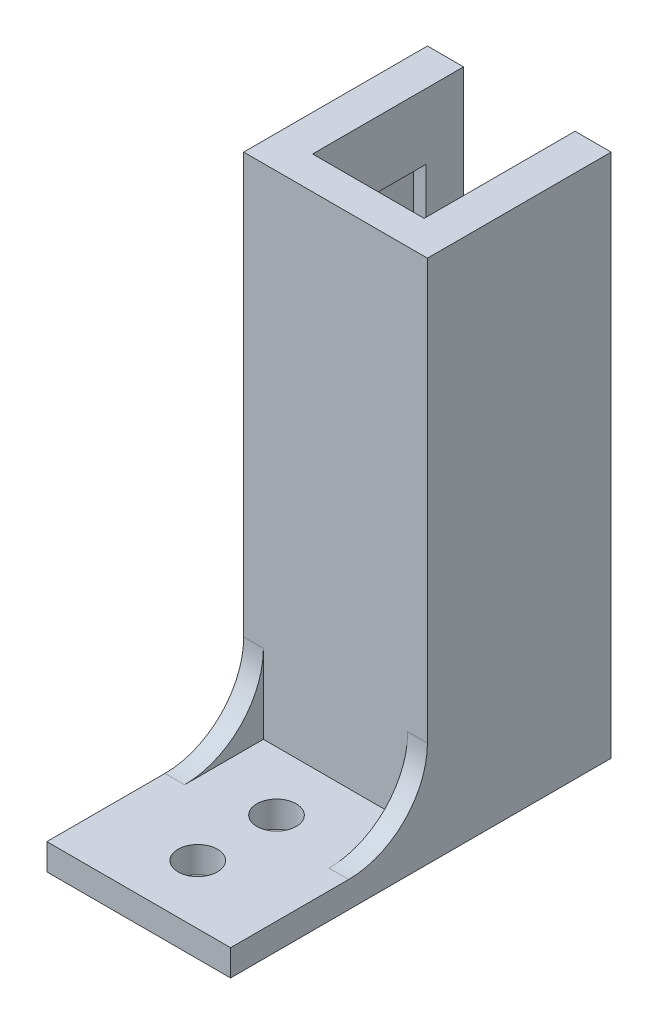
ISO-10303-21;
HEADER;
FILE_DESCRIPTION(('STEP AP214'),'2;1');
FILE_NAME('part.step','',(''),(''),'','','');
FILE_SCHEMA(('AUTOMOTIVE_DESIGN { 1 0 10303 214 1 1 1 1 }'));
ENDSEC;
DATA;
#1=APPLICATION_CONTEXT('core data for automotive mechanical design processes');
#2=APPLICATION_PROTOCOL_DEFINITION('international standard','automotive_design',2000,#1);
#3=PRODUCT_CONTEXT('',#1,'mechanical');
#4=PRODUCT('Part','Part','',(#3));
#5=PRODUCT_RELATED_PRODUCT_CATEGORY('part','',(#4));
#6=PRODUCT_DEFINITION_FORMATION('','',#4);
#7=PRODUCT_DEFINITION_CONTEXT('part definition',#1,'design');
#8=PRODUCT_DEFINITION('design','',#6,#7);
#9=PRODUCT_DEFINITION_SHAPE('','',#8);
#10=(LENGTH_UNIT() NAMED_UNIT(*) SI_UNIT(.MILLI.,.METRE.));
#11=(NAMED_UNIT(*) PLANE_ANGLE_UNIT() SI_UNIT($,.RADIAN.));
#12=(NAMED_UNIT(*) SI_UNIT($,.STERADIAN.) SOLID_ANGLE_UNIT());
#13=UNCERTAINTY_MEASURE_WITH_UNIT(LENGTH_MEASURE(1.E-05),#10,'distance_accuracy_value','');
#14=(GEOMETRIC_REPRESENTATION_CONTEXT(3) GLOBAL_UNCERTAINTY_ASSIGNED_CONTEXT((#13)) GLOBAL_UNIT_ASSIGNED_CONTEXT((#10,
#11,#12)) REPRESENTATION_CONTEXT('',''));
#15=CARTESIAN_POINT('',(0.,0.,0.));
#16=DIRECTION('',(0.,0.,1.));
#17=DIRECTION('',(1.,0.,0.));
#18=AXIS2_PLACEMENT_3D('',#15,#16,#17);
#19=CARTESIAN_POINT('',(-5.20000000000001,15.,0.));
#20=DIRECTION('',(1.,0.,0.));
#21=DIRECTION('',(0.,1.,0.));
#22=AXIS2_PLACEMENT_3D('',#19,#20,#21);
#23=PLANE('',#22);
#24=DIRECTION('',(0.,-1.,0.));
#25=VECTOR('',#24,1.);
#26=CARTESIAN_POINT('',(-5.20000000000001,15.,11.5));
#27=LINE('',#26,#25);
#28=CARTESIAN_POINT('',(-5.20000000000001,15.,11.5));
#29=VERTEX_POINT('',#28);
#30=CARTESIAN_POINT('',(-5.2,0.,11.5));
#31=VERTEX_POINT('',#30);
#32=EDGE_CURVE('E232',#29,#31,#27,.T.);
#33=ORIENTED_EDGE('',*,*,#32,.T.);
#34=DIRECTION('',(0.,0.,1.));
#35=VECTOR('',#34,1.);
#36=CARTESIAN_POINT('',(-5.2,0.,11.5));
#37=LINE('',#36,#35);
#38=CARTESIAN_POINT('',(-5.2,0.,2.85));
#39=VERTEX_POINT('',#38);
#40=EDGE_CURVE('E217',#39,#31,#37,.T.);
#41=ORIENTED_EDGE('',*,*,#40,.F.);
#42=DIRECTION('',(0.,-1.,0.));
#43=VECTOR('',#42,1.);
#44=CARTESIAN_POINT('',(-5.20000000000001,15.,2.85));
#45=LINE('',#44,#43);
#46=CARTESIAN_POINT('',(-5.20000000000001,15.,2.85));
#47=VERTEX_POINT('',#46);
#48=EDGE_CURVE('E256',#47,#39,#45,.T.);
#49=ORIENTED_EDGE('',*,*,#48,.F.);
#50=DIRECTION('',(0.,0.,1.));
#51=VECTOR('',#50,1.);
#52=CARTESIAN_POINT('',(-5.20000000000001,15.,0.));
#53=LINE('',#52,#51);
#54=EDGE_CURVE('E223',#47,#29,#53,.T.);
#55=ORIENTED_EDGE('',*,*,#54,.T.);
#56=EDGE_LOOP('',(#33,#41,#49,#55));
#57=FACE_BOUND('',#56,.T.);
#58=ADVANCED_FACE('F44',(#57),#23,.T.);
#59=CARTESIAN_POINT('',(0.,15.,2.85));
#60=DIRECTION('',(0.,0.,1.));
#61=DIRECTION('',(1.,0.,0.));
#62=AXIS2_PLACEMENT_3D('',#59,#60,#61);
#63=PLANE('',#62);
#64=ORIENTED_EDGE('',*,*,#48,.T.);
#65=DIRECTION('',(-1.,0.,0.));
#66=VECTOR('',#65,1.);
#67=CARTESIAN_POINT('',(-5.19999999999999,0.,2.85));
#68=LINE('',#67,#66);
#69=CARTESIAN_POINT('',(-4.25,0.,2.85));
#70=VERTEX_POINT('',#69);
#71=EDGE_CURVE('E369',#70,#39,#68,.T.);
#72=ORIENTED_EDGE('',*,*,#71,.F.);
#73=DIRECTION('',(0.,-1.,0.));
#74=VECTOR('',#73,1.);
#75=CARTESIAN_POINT('',(-4.25000000000001,15.,2.85));
#76=LINE('',#75,#74);
#77=CARTESIAN_POINT('',(-4.25,15.,2.85));
#78=VERTEX_POINT('',#77);
#79=EDGE_CURVE('E253',#78,#70,#76,.T.);
#80=ORIENTED_EDGE('',*,*,#79,.F.);
#81=DIRECTION('',(-1.,0.,0.));
#82=VECTOR('',#81,1.);
#83=CARTESIAN_POINT('',(0.,15.,2.85));
#84=LINE('',#83,#82);
#85=EDGE_CURVE('E228',#78,#47,#84,.T.);
#86=ORIENTED_EDGE('',*,*,#85,.T.);
#87=EDGE_LOOP('',(#64,#72,#80,#86));
#88=FACE_BOUND('',#87,.T.);
#89=ADVANCED_FACE('F497',(#88),#63,.T.);
#90=CARTESIAN_POINT('',(5.19999999999999,15.,0.));
#91=DIRECTION('',(1.,0.,0.));
#92=DIRECTION('',(0.,1.,0.));
#93=AXIS2_PLACEMENT_3D('',#90,#91,#92);
#94=PLANE('',#93);
#95=DIRECTION('',(0.,0.,-1.));
#96=VECTOR('',#95,1.);
#97=CARTESIAN_POINT('',(5.2,0.,11.5));
#98=LINE('',#97,#96);
#99=CARTESIAN_POINT('',(5.2,0.,11.5));
#100=VERTEX_POINT('',#99);
#101=CARTESIAN_POINT('',(5.2,0.,2.85));
#102=VERTEX_POINT('',#101);
#103=EDGE_CURVE('E378',#100,#102,#98,.T.);
#104=ORIENTED_EDGE('',*,*,#103,.F.);
#105=DIRECTION('',(0.,-1.,0.));
#106=VECTOR('',#105,1.);
#107=CARTESIAN_POINT('',(5.19999999999999,15.,11.5));
#108=LINE('',#107,#106);
#109=CARTESIAN_POINT('',(5.19999999999999,15.,11.5));
#110=VERTEX_POINT('',#109);
#111=EDGE_CURVE('E237',#110,#100,#108,.T.);
#112=ORIENTED_EDGE('',*,*,#111,.F.);
#113=DIRECTION('',(0.,0.,1.));
#114=VECTOR('',#113,1.);
#115=CARTESIAN_POINT('',(5.19999999999999,15.,0.));
#116=LINE('',#115,#114);
#117=CARTESIAN_POINT('',(5.19999999999999,15.,2.85));
#118=VERTEX_POINT('',#117);
#119=EDGE_CURVE('E341',#118,#110,#116,.T.);
#120=ORIENTED_EDGE('',*,*,#119,.F.);
#121=DIRECTION('',(0.,-1.,0.));
#122=VECTOR('',#121,1.);
#123=CARTESIAN_POINT('',(5.19999999999999,15.,2.85));
#124=LINE('',#123,#122);
#125=EDGE_CURVE('E240',#118,#102,#124,.T.);
#126=ORIENTED_EDGE('',*,*,#125,.T.);
#127=EDGE_LOOP('',(#104,#112,#120,#126));
#128=FACE_BOUND('',#127,.T.);
#129=ADVANCED_FACE('F516',(#128),#94,.F.);
#130=DIRECTION('',(0.,-1.,0.));
#131=VECTOR('',#130,1.);
#132=CARTESIAN_POINT('',(4.24999999999999,15.,2.85));
#133=LINE('',#132,#131);
#134=CARTESIAN_POINT('',(4.25,15.,2.85));
#135=VERTEX_POINT('',#134);
#136=CARTESIAN_POINT('',(4.24999999999999,0.,2.85));
#137=VERTEX_POINT('',#136);
#138=EDGE_CURVE('E244',#135,#137,#133,.T.);
#139=ORIENTED_EDGE('',*,*,#138,.T.);
#140=DIRECTION('',(-1.,0.,0.));
#141=VECTOR('',#140,1.);
#142=CARTESIAN_POINT('',(5.2,0.,2.85));
#143=LINE('',#142,#141);
#144=EDGE_CURVE('E374',#102,#137,#143,.T.);
#145=ORIENTED_EDGE('',*,*,#144,.F.);
#146=ORIENTED_EDGE('',*,*,#125,.F.);
#147=EDGE_CURVE('E340',#118,#135,#84,.T.);
#148=ORIENTED_EDGE('',*,*,#147,.T.);
#149=EDGE_LOOP('',(#139,#145,#146,#148));
#150=FACE_BOUND('',#149,.T.);
#151=ADVANCED_FACE('F518',(#150),#63,.T.);
#152=CARTESIAN_POINT('',(0.,0.,0.));
#153=DIRECTION('',(0.,0.,1.));
#154=DIRECTION('',(1.,0.,0.));
#155=AXIS2_PLACEMENT_3D('',#152,#153,#154);
#156=PLANE('',#155);
#157=DIRECTION('',(0.,-1.,0.));
#158=VECTOR('',#157,1.);
#159=CARTESIAN_POINT('',(4.24999999999999,15.,0.));
#160=LINE('',#159,#158);
#161=CARTESIAN_POINT('',(4.24999999999999,20.,0.));
#162=VERTEX_POINT('',#161);
#163=CARTESIAN_POINT('',(4.25,-20.,0.));
#164=VERTEX_POINT('',#163);
#165=EDGE_CURVE('E247',#162,#164,#160,.T.);
#166=ORIENTED_EDGE('',*,*,#165,.F.);
#167=DIRECTION('',(-1.,0.,0.));
#168=VECTOR('',#167,1.);
#169=CARTESIAN_POINT('',(0.,20.,0.));
#170=LINE('',#169,#168);
#171=CARTESIAN_POINT('',(7.,20.,0.));
#172=VERTEX_POINT('',#171);
#173=EDGE_CURVE('E275',#172,#162,#170,.T.);
#174=ORIENTED_EDGE('',*,*,#173,.F.);
#175=DIRECTION('',(0.,-1.,0.));
#176=VECTOR('',#175,1.);
#177=CARTESIAN_POINT('',(7.,0.,0.));
#178=LINE('',#177,#176);
#179=CARTESIAN_POINT('',(7.,-20.,0.));
#180=VERTEX_POINT('',#179);
#181=EDGE_CURVE('E266',#172,#180,#178,.T.);
#182=ORIENTED_EDGE('',*,*,#181,.T.);
#183=DIRECTION('',(-1.,0.,0.));
#184=VECTOR('',#183,1.);
#185=CARTESIAN_POINT('',(0.,-20.,0.));
#186=LINE('',#185,#184);
#187=EDGE_CURVE('E283',#180,#164,#186,.T.);
#188=ORIENTED_EDGE('',*,*,#187,.T.);
#189=EDGE_LOOP('',(#166,#174,#182,#188));
#190=FACE_BOUND('',#189,.T.);
#191=ADVANCED_FACE('F489',(#190),#156,.F.);
#192=CARTESIAN_POINT('',(0.,15.,0.));
#193=DIRECTION('',(0.,-1.,0.));
#194=DIRECTION('',(1.,0.,0.));
#195=AXIS2_PLACEMENT_3D('',#192,#193,#194);
#196=PLANE('',#195);
#197=DIRECTION('',(0.,0.,1.));
#198=VECTOR('',#197,1.);
#199=CARTESIAN_POINT('',(4.25,15.,0.));
#200=LINE('',#199,#198);
#201=CARTESIAN_POINT('',(4.25,15.,11.5));
#202=VERTEX_POINT('',#201);
#203=EDGE_CURVE('E13',#135,#202,#200,.T.);
#204=ORIENTED_EDGE('',*,*,#203,.F.);
#205=ORIENTED_EDGE('',*,*,#147,.F.);
#206=ORIENTED_EDGE('',*,*,#119,.T.);
#207=DIRECTION('',(-1.,0.,0.));
#208=VECTOR('',#207,1.);
#209=CARTESIAN_POINT('',(0.,15.,11.5));
#210=LINE('',#209,#208);
#211=EDGE_CURVE('E260',#110,#202,#210,.T.);
#212=ORIENTED_EDGE('',*,*,#211,.T.);
#213=EDGE_LOOP('',(#204,#205,#206,#212));
#214=FACE_BOUND('',#213,.T.);
#215=ADVANCED_FACE('F524',(#214),#196,.T.);
#216=CARTESIAN_POINT('',(0.,0.,14.));
#217=DIRECTION('',(0.,0.,1.));
#218=DIRECTION('',(1.,0.,0.));
#219=AXIS2_PLACEMENT_3D('',#216,#217,#218);
#220=PLANE('',#219);
#221=DIRECTION('',(0.,-1.,0.));
#222=VECTOR('',#221,1.);
#223=CARTESIAN_POINT('',(5.5,-12.,14.));
#224=LINE('',#223,#222);
#225=CARTESIAN_POINT('',(5.5,-12.,14.));
#226=VERTEX_POINT('',#225);
#227=CARTESIAN_POINT('',(5.5,-18.,14.));
#228=VERTEX_POINT('',#227);
#229=EDGE_CURVE('E408',#226,#228,#224,.T.);
#230=ORIENTED_EDGE('',*,*,#229,.F.);
#231=DIRECTION('',(1.,0.,0.));
#232=VECTOR('',#231,1.);
#233=CARTESIAN_POINT('',(5.5,-12.,14.));
#234=LINE('',#233,#232);
#235=CARTESIAN_POINT('',(7.,-12.,14.));
#236=VERTEX_POINT('',#235);
#237=EDGE_CURVE('E414',#226,#236,#234,.T.);
#238=ORIENTED_EDGE('',*,*,#237,.T.);
#239=DIRECTION('',(0.,-1.,0.));
#240=VECTOR('',#239,1.);
#241=CARTESIAN_POINT('',(7.,0.,14.));
#242=LINE('',#241,#240);
#243=CARTESIAN_POINT('',(7.,20.,14.));
#244=VERTEX_POINT('',#243);
#245=EDGE_CURVE('E270',#244,#236,#242,.T.);
#246=ORIENTED_EDGE('',*,*,#245,.F.);
#247=DIRECTION('',(-1.,0.,0.));
#248=VECTOR('',#247,1.);
#249=CARTESIAN_POINT('',(0.,20.,14.));
#250=LINE('',#249,#248);
#251=CARTESIAN_POINT('',(-7.,20.,14.));
#252=VERTEX_POINT('',#251);
#253=EDGE_CURVE('E261',#244,#252,#250,.T.);
#254=ORIENTED_EDGE('',*,*,#253,.T.);
#255=DIRECTION('',(0.,-1.,0.));
#256=VECTOR('',#255,1.);
#257=CARTESIAN_POINT('',(-7.,0.,14.));
#258=LINE('',#257,#256);
#259=CARTESIAN_POINT('',(-7.,-12.,14.));
#260=VERTEX_POINT('',#259);
#261=EDGE_CURVE('E265',#252,#260,#258,.T.);
#262=ORIENTED_EDGE('',*,*,#261,.T.);
#263=DIRECTION('',(-1.,0.,0.));
#264=VECTOR('',#263,1.);
#265=CARTESIAN_POINT('',(-5.5,-12.,14.));
#266=LINE('',#265,#264);
#267=CARTESIAN_POINT('',(-5.5,-12.,14.));
#268=VERTEX_POINT('',#267);
#269=EDGE_CURVE('E434',#268,#260,#266,.T.);
#270=ORIENTED_EDGE('',*,*,#269,.F.);
#271=DIRECTION('',(0.,-1.,0.));
#272=VECTOR('',#271,1.);
#273=CARTESIAN_POINT('',(-5.5,-12.,14.));
#274=LINE('',#273,#272);
#275=CARTESIAN_POINT('',(-5.5,-18.,14.));
#276=VERTEX_POINT('',#275);
#277=EDGE_CURVE('E426',#268,#276,#274,.T.);
#278=ORIENTED_EDGE('',*,*,#277,.T.);
#279=DIRECTION('',(1.,0.,0.));
#280=VECTOR('',#279,1.);
#281=CARTESIAN_POINT('',(7.,-18.,14.));
#282=LINE('',#281,#280);
#283=EDGE_CURVE('E333',#276,#228,#282,.T.);
#284=ORIENTED_EDGE('',*,*,#283,.T.);
#285=EDGE_LOOP('',(#230,#238,#246,#254,#262,#270,#278,#284));
#286=FACE_BOUND('',#285,.T.);
#287=ADVANCED_FACE('F471',(#286),#220,.T.);
#288=CARTESIAN_POINT('',(0.,-18.,0.));
#289=DIRECTION('',(0.,-1.,0.));
#290=DIRECTION('',(1.,0.,0.));
#291=AXIS2_PLACEMENT_3D('',#288,#289,#290);
#292=PLANE('',#291);
#293=CARTESIAN_POINT('',(0.,-18.,24.5));
#294=DIRECTION('',(0.,-1.,0.));
#295=DIRECTION('',(1.,0.,0.));
#296=AXIS2_PLACEMENT_3D('',#293,#294,#295);
#297=CIRCLE('',#296,1.5);
#298=CARTESIAN_POINT('',(1.5,-18.,24.5));
#299=VERTEX_POINT('',#298);
#300=EDGE_CURVE('E444',#299,#299,#297,.T.);
#301=ORIENTED_EDGE('',*,*,#300,.T.);
#302=EDGE_LOOP('',(#301));
#303=FACE_BOUND('',#302,.T.);
#304=CARTESIAN_POINT('',(0.,-18.,18.5));
#305=DIRECTION('',(0.,-1.,0.));
#306=DIRECTION('',(1.,0.,0.));
#307=AXIS2_PLACEMENT_3D('',#304,#305,#306);
#308=CIRCLE('',#307,1.5);
#309=CARTESIAN_POINT('',(1.5,-18.,18.5));
#310=VERTEX_POINT('',#309);
#311=EDGE_CURVE('E452',#310,#310,#308,.T.);
#312=ORIENTED_EDGE('',*,*,#311,.T.);
#313=EDGE_LOOP('',(#312));
#314=FACE_BOUND('',#313,.T.);
#315=DIRECTION('',(1.,0.,0.));
#316=VECTOR('',#315,1.);
#317=CARTESIAN_POINT('',(5.5,-18.,20.));
#318=LINE('',#317,#316);
#319=CARTESIAN_POINT('',(5.5,-18.,20.));
#320=VERTEX_POINT('',#319);
#321=CARTESIAN_POINT('',(7.,-18.,20.));
#322=VERTEX_POINT('',#321);
#323=EDGE_CURVE('E411',#320,#322,#318,.T.);
#324=ORIENTED_EDGE('',*,*,#323,.F.);
#325=DIRECTION('',(0.,0.,1.));
#326=VECTOR('',#325,1.);
#327=CARTESIAN_POINT('',(5.5,-18.,14.));
#328=LINE('',#327,#326);
#329=EDGE_CURVE('E405',#228,#320,#328,.T.);
#330=ORIENTED_EDGE('',*,*,#329,.F.);
#331=ORIENTED_EDGE('',*,*,#283,.F.);
#332=DIRECTION('',(0.,0.,1.));
#333=VECTOR('',#332,1.);
#334=CARTESIAN_POINT('',(-5.5,-18.,14.));
#335=LINE('',#334,#333);
#336=CARTESIAN_POINT('',(-5.5,-18.,20.));
#337=VERTEX_POINT('',#336);
#338=EDGE_CURVE('E430',#276,#337,#335,.T.);
#339=ORIENTED_EDGE('',*,*,#338,.T.);
#340=DIRECTION('',(-1.,0.,0.));
#341=VECTOR('',#340,1.);
#342=CARTESIAN_POINT('',(-5.5,-18.,20.));
#343=LINE('',#342,#341);
#344=CARTESIAN_POINT('',(-7.,-18.,20.));
#345=VERTEX_POINT('',#344);
#346=EDGE_CURVE('E437',#337,#345,#343,.T.);
#347=ORIENTED_EDGE('',*,*,#346,.T.);
#348=DIRECTION('',(0.,0.,-1.));
#349=VECTOR('',#348,1.);
#350=CARTESIAN_POINT('',(-7.,-18.,14.));
#351=LINE('',#350,#349);
#352=CARTESIAN_POINT('',(-7.,-18.,29.));
#353=VERTEX_POINT('',#352);
#354=EDGE_CURVE('E464',#353,#345,#351,.T.);
#355=ORIENTED_EDGE('',*,*,#354,.F.);
#356=DIRECTION('',(-1.,0.,0.));
#357=VECTOR('',#356,1.);
#358=CARTESIAN_POINT('',(7.,-18.,29.));
#359=LINE('',#358,#357);
#360=CARTESIAN_POINT('',(7.,-18.,29.));
#361=VERTEX_POINT('',#360);
#362=EDGE_CURVE('E327',#361,#353,#359,.T.);
#363=ORIENTED_EDGE('',*,*,#362,.F.);
#364=DIRECTION('',(0.,0.,1.));
#365=VECTOR('',#364,1.);
#366=CARTESIAN_POINT('',(7.,-18.,14.));
#367=LINE('',#366,#365);
#368=EDGE_CURVE('E459',#322,#361,#367,.T.);
#369=ORIENTED_EDGE('',*,*,#368,.F.);
#370=EDGE_LOOP('',(#324,#330,#331,#339,#347,#355,#363,#369));
#371=FACE_BOUND('',#370,.T.);
#372=ADVANCED_FACE('F476',(#303,#314,#371),#292,.F.);
#373=CARTESIAN_POINT('',(0.,-20.,14.));
#374=DIRECTION('',(0.,-1.,0.));
#375=DIRECTION('',(0.,0.,-1.));
#376=AXIS2_PLACEMENT_3D('',#373,#374,#375);
#377=PLANE('',#376);
#378=DIRECTION('',(-1.,0.,0.));
#379=VECTOR('',#378,1.);
#380=CARTESIAN_POINT('',(0.,-20.,11.5));
#381=LINE('',#380,#379);
#382=CARTESIAN_POINT('',(4.25,-20.,11.5));
#383=VERTEX_POINT('',#382);
#384=CARTESIAN_POINT('',(-4.25,-20.,11.5));
#385=VERTEX_POINT('',#384);
#386=EDGE_CURVE('E202',#383,#385,#381,.T.);
#387=ORIENTED_EDGE('',*,*,#386,.F.);
#388=DIRECTION('',(0.,0.,-1.));
#389=VECTOR('',#388,1.);
#390=CARTESIAN_POINT('',(4.25,-20.,0.));
#391=LINE('',#390,#389);
#392=EDGE_CURVE('E208',#383,#164,#391,.T.);
#393=ORIENTED_EDGE('',*,*,#392,.T.);
#394=ORIENTED_EDGE('',*,*,#187,.F.);
#395=DIRECTION('',(0.,0.,-1.));
#396=VECTOR('',#395,1.);
#397=CARTESIAN_POINT('',(7.,-20.,14.));
#398=LINE('',#397,#396);
#399=CARTESIAN_POINT('',(7.,-20.,29.));
#400=VERTEX_POINT('',#399);
#401=EDGE_CURVE('E292',#400,#180,#398,.T.);
#402=ORIENTED_EDGE('',*,*,#401,.F.);
#403=DIRECTION('',(-1.,0.,0.));
#404=VECTOR('',#403,1.);
#405=CARTESIAN_POINT('',(7.,-20.,29.));
#406=LINE('',#405,#404);
#407=CARTESIAN_POINT('',(-7.,-20.,29.));
#408=VERTEX_POINT('',#407);
#409=EDGE_CURVE('E318',#400,#408,#406,.T.);
#410=ORIENTED_EDGE('',*,*,#409,.T.);
#411=DIRECTION('',(0.,0.,-1.));
#412=VECTOR('',#411,1.);
#413=CARTESIAN_POINT('',(-7.,-20.,14.));
#414=LINE('',#413,#412);
#415=CARTESIAN_POINT('',(-7.,-20.,0.));
#416=VERTEX_POINT('',#415);
#417=EDGE_CURVE('E295',#408,#416,#414,.T.);
#418=ORIENTED_EDGE('',*,*,#417,.T.);
#419=CARTESIAN_POINT('',(-4.25,-20.,0.));
#420=VERTEX_POINT('',#419);
#421=EDGE_CURVE('E204',#420,#416,#186,.T.);
#422=ORIENTED_EDGE('',*,*,#421,.F.);
#423=DIRECTION('',(0.,0.,-1.));
#424=VECTOR('',#423,1.);
#425=CARTESIAN_POINT('',(-4.25,-20.,0.));
#426=LINE('',#425,#424);
#427=EDGE_CURVE('E196',#385,#420,#426,.T.);
#428=ORIENTED_EDGE('',*,*,#427,.F.);
#429=EDGE_LOOP('',(#387,#393,#394,#402,#410,#418,#422,#428));
#430=FACE_BOUND('',#429,.T.);
#431=CARTESIAN_POINT('',(0.,-20.,24.5));
#432=DIRECTION('',(0.,-1.,0.));
#433=DIRECTION('',(1.,0.,0.));
#434=AXIS2_PLACEMENT_3D('',#431,#432,#433);
#435=CIRCLE('',#434,1.5);
#436=CARTESIAN_POINT('',(1.5,-20.,24.5));
#437=VERTEX_POINT('',#436);
#438=EDGE_CURVE('E441',#437,#437,#435,.T.);
#439=ORIENTED_EDGE('',*,*,#438,.F.);
#440=EDGE_LOOP('',(#439));
#441=FACE_BOUND('',#440,.T.);
#442=CARTESIAN_POINT('',(0.,-20.,18.5));
#443=DIRECTION('',(0.,-1.,0.));
#444=DIRECTION('',(1.,0.,0.));
#445=AXIS2_PLACEMENT_3D('',#442,#443,#444);
#446=CIRCLE('',#445,1.5);
#447=CARTESIAN_POINT('',(1.5,-20.,18.5));
#448=VERTEX_POINT('',#447);
#449=EDGE_CURVE('E448',#448,#448,#446,.T.);
#450=ORIENTED_EDGE('',*,*,#449,.F.);
#451=EDGE_LOOP('',(#450));
#452=FACE_BOUND('',#451,.T.);
#453=ADVANCED_FACE('F198',(#430,#441,#452),#377,.T.);
#454=CARTESIAN_POINT('',(-4.25,20.,0.));
#455=VERTEX_POINT('',#454);
#456=CARTESIAN_POINT('',(-7.,20.,0.));
#457=VERTEX_POINT('',#456);
#458=EDGE_CURVE('E236',#455,#457,#170,.T.);
#459=ORIENTED_EDGE('',*,*,#458,.F.);
#460=DIRECTION('',(0.,-1.,0.));
#461=VECTOR('',#460,1.);
#462=CARTESIAN_POINT('',(-4.25000000000001,15.,0.));
#463=LINE('',#462,#461);
#464=EDGE_CURVE('E250',#455,#420,#463,.T.);
#465=ORIENTED_EDGE('',*,*,#464,.T.);
#466=ORIENTED_EDGE('',*,*,#421,.T.);
#467=DIRECTION('',(0.,-1.,0.));
#468=VECTOR('',#467,1.);
#469=CARTESIAN_POINT('',(-7.,0.,0.));
#470=LINE('',#469,#468);
#471=EDGE_CURVE('E279',#457,#416,#470,.T.);
#472=ORIENTED_EDGE('',*,*,#471,.F.);
#473=EDGE_LOOP('',(#459,#465,#466,#472));
#474=FACE_BOUND('',#473,.T.);
#475=ADVANCED_FACE('F314',(#474),#156,.F.);
#476=CARTESIAN_POINT('',(0.,20.,14.));
#477=DIRECTION('',(0.,-1.,0.));
#478=DIRECTION('',(0.,0.,-1.));
#479=AXIS2_PLACEMENT_3D('',#476,#477,#478);
#480=PLANE('',#479);
#481=ORIENTED_EDGE('',*,*,#173,.T.);
#482=DIRECTION('',(0.,0.,1.));
#483=VECTOR('',#482,1.);
#484=CARTESIAN_POINT('',(4.24999999999999,20.,0.));
#485=LINE('',#484,#483);
#486=CARTESIAN_POINT('',(4.24999999999999,20.,11.5));
#487=VERTEX_POINT('',#486);
#488=EDGE_CURVE('E384',#162,#487,#485,.T.);
#489=ORIENTED_EDGE('',*,*,#488,.T.);
#490=DIRECTION('',(-1.,0.,0.));
#491=VECTOR('',#490,1.);
#492=CARTESIAN_POINT('',(4.24999999999999,20.,11.5));
#493=LINE('',#492,#491);
#494=CARTESIAN_POINT('',(-4.25,20.,11.5));
#495=VERTEX_POINT('',#494);
#496=EDGE_CURVE('E388',#487,#495,#493,.T.);
#497=ORIENTED_EDGE('',*,*,#496,.T.);
#498=DIRECTION('',(0.,0.,-1.));
#499=VECTOR('',#498,1.);
#500=CARTESIAN_POINT('',(-4.25,20.,0.));
#501=LINE('',#500,#499);
#502=EDGE_CURVE('E311',#495,#455,#501,.T.);
#503=ORIENTED_EDGE('',*,*,#502,.T.);
#504=ORIENTED_EDGE('',*,*,#458,.T.);
#505=DIRECTION('',(0.,0.,-1.));
#506=VECTOR('',#505,1.);
#507=CARTESIAN_POINT('',(-7.,20.,14.));
#508=LINE('',#507,#506);
#509=EDGE_CURVE('E53',#252,#457,#508,.T.);
#510=ORIENTED_EDGE('',*,*,#509,.F.);
#511=ORIENTED_EDGE('',*,*,#253,.F.);
#512=DIRECTION('',(0.,0.,-1.));
#513=VECTOR('',#512,1.);
#514=CARTESIAN_POINT('',(7.,20.,14.));
#515=LINE('',#514,#513);
#516=EDGE_CURVE('E274',#244,#172,#515,.T.);
#517=ORIENTED_EDGE('',*,*,#516,.T.);
#518=EDGE_LOOP('',(#481,#489,#497,#503,#504,#510,#511,#517));
#519=FACE_BOUND('',#518,.T.);
#520=ADVANCED_FACE('F46',(#519),#480,.F.);
#521=CARTESIAN_POINT('',(-7.,0.,14.));
#522=DIRECTION('',(1.,0.,0.));
#523=DIRECTION('',(0.,1.,0.));
#524=AXIS2_PLACEMENT_3D('',#521,#522,#523);
#525=PLANE('',#524);
#526=ORIENTED_EDGE('',*,*,#471,.T.);
#527=ORIENTED_EDGE('',*,*,#417,.F.);
#528=DIRECTION('',(0.,-1.,0.));
#529=VECTOR('',#528,1.);
#530=CARTESIAN_POINT('',(-7.,-18.,29.));
#531=LINE('',#530,#529);
#532=EDGE_CURVE('E209',#353,#408,#531,.T.);
#533=ORIENTED_EDGE('',*,*,#532,.F.);
#534=ORIENTED_EDGE('',*,*,#354,.T.);
#535=CARTESIAN_POINT('',(-7.,-12.,20.));
#536=DIRECTION('',(1.,0.,0.));
#537=DIRECTION('',(0.,1.,0.));
#538=AXIS2_PLACEMENT_3D('',#535,#536,#537);
#539=CIRCLE('',#538,6.);
#540=EDGE_CURVE('E418',#345,#260,#539,.T.);
#541=ORIENTED_EDGE('',*,*,#540,.T.);
#542=ORIENTED_EDGE('',*,*,#261,.F.);
#543=ORIENTED_EDGE('',*,*,#509,.T.);
#544=EDGE_LOOP('',(#526,#527,#533,#534,#541,#542,#543));
#545=FACE_BOUND('',#544,.T.);
#546=ADVANCED_FACE('F301',(#545),#525,.F.);
#547=CARTESIAN_POINT('',(7.,0.,14.));
#548=DIRECTION('',(1.,0.,0.));
#549=DIRECTION('',(0.,1.,0.));
#550=AXIS2_PLACEMENT_3D('',#547,#548,#549);
#551=PLANE('',#550);
#552=ORIENTED_EDGE('',*,*,#181,.F.);
#553=ORIENTED_EDGE('',*,*,#516,.F.);
#554=ORIENTED_EDGE('',*,*,#245,.T.);
#555=CARTESIAN_POINT('',(7.,-12.,20.));
#556=DIRECTION('',(1.,0.,0.));
#557=DIRECTION('',(0.,1.,0.));
#558=AXIS2_PLACEMENT_3D('',#555,#556,#557);
#559=CIRCLE('',#558,6.);
#560=EDGE_CURVE('E399',#322,#236,#559,.T.);
#561=ORIENTED_EDGE('',*,*,#560,.F.);
#562=ORIENTED_EDGE('',*,*,#368,.T.);
#563=DIRECTION('',(0.,-1.,0.));
#564=VECTOR('',#563,1.);
#565=CARTESIAN_POINT('',(7.,-18.,29.));
#566=LINE('',#565,#564);
#567=EDGE_CURVE('E329',#361,#400,#566,.T.);
#568=ORIENTED_EDGE('',*,*,#567,.T.);
#569=ORIENTED_EDGE('',*,*,#401,.T.);
#570=EDGE_LOOP('',(#552,#553,#554,#561,#562,#568,#569));
#571=FACE_BOUND('',#570,.T.);
#572=ADVANCED_FACE('F486',(#571),#551,.T.);
#573=CARTESIAN_POINT('',(0.,15.,11.5));
#574=DIRECTION('',(0.,0.,1.));
#575=DIRECTION('',(1.,0.,0.));
#576=AXIS2_PLACEMENT_3D('',#573,#574,#575);
#577=PLANE('',#576);
#578=ORIENTED_EDGE('',*,*,#386,.T.);
#579=DIRECTION('',(0.,-1.,0.));
#580=VECTOR('',#579,1.);
#581=CARTESIAN_POINT('',(-4.25,23.7020112617716,11.5));
#582=LINE('',#581,#580);
#583=CARTESIAN_POINT('',(-4.25,0.,11.5));
#584=VERTEX_POINT('',#583);
#585=EDGE_CURVE('E212',#584,#385,#582,.T.);
#586=ORIENTED_EDGE('',*,*,#585,.F.);
#587=DIRECTION('',(1.,0.,0.));
#588=VECTOR('',#587,1.);
#589=CARTESIAN_POINT('',(-4.24999999999999,0.,11.5));
#590=LINE('',#589,#588);
#591=EDGE_CURVE('E362',#31,#584,#590,.T.);
#592=ORIENTED_EDGE('',*,*,#591,.F.);
#593=ORIENTED_EDGE('',*,*,#32,.F.);
#594=CARTESIAN_POINT('',(-4.25,15.,11.5));
#595=VERTEX_POINT('',#594);
#596=EDGE_CURVE('E345',#595,#29,#210,.T.);
#597=ORIENTED_EDGE('',*,*,#596,.F.);
#598=DIRECTION('',(0.,-1.,0.));
#599=VECTOR('',#598,1.);
#600=CARTESIAN_POINT('',(-4.25,20.,11.5));
#601=LINE('',#600,#599);
#602=EDGE_CURVE('E396',#495,#595,#601,.T.);
#603=ORIENTED_EDGE('',*,*,#602,.F.);
#604=ORIENTED_EDGE('',*,*,#496,.F.);
#605=DIRECTION('',(0.,-1.,0.));
#606=VECTOR('',#605,1.);
#607=CARTESIAN_POINT('',(4.24999999999999,20.,11.5));
#608=LINE('',#607,#606);
#609=EDGE_CURVE('E393',#487,#202,#608,.T.);
#610=ORIENTED_EDGE('',*,*,#609,.T.);
#611=ORIENTED_EDGE('',*,*,#211,.F.);
#612=ORIENTED_EDGE('',*,*,#111,.T.);
#613=DIRECTION('',(1.,0.,0.));
#614=VECTOR('',#613,1.);
#615=CARTESIAN_POINT('',(4.25,0.,11.5));
#616=LINE('',#615,#614);
#617=CARTESIAN_POINT('',(4.25,0.,11.5));
#618=VERTEX_POINT('',#617);
#619=EDGE_CURVE('E68',#618,#100,#616,.T.);
#620=ORIENTED_EDGE('',*,*,#619,.F.);
#621=DIRECTION('',(0.,-1.,0.));
#622=VECTOR('',#621,1.);
#623=CARTESIAN_POINT('',(4.25,23.7020112617716,11.5));
#624=LINE('',#623,#622);
#625=EDGE_CURVE('E221',#618,#383,#624,.T.);
#626=ORIENTED_EDGE('',*,*,#625,.T.);
#627=EDGE_LOOP('',(#578,#586,#592,#593,#597,#603,#604,#610,#611,#612,#620,#626));
#628=FACE_BOUND('',#627,.T.);
#629=ADVANCED_FACE('F219',(#628),#577,.F.);
#630=CARTESIAN_POINT('',(4.24999999999999,15.,0.));
#631=DIRECTION('',(-1.,0.,0.));
#632=DIRECTION('',(0.,0.,1.));
#633=AXIS2_PLACEMENT_3D('',#630,#631,#632);
#634=PLANE('',#633);
#635=ORIENTED_EDGE('',*,*,#392,.F.);
#636=ORIENTED_EDGE('',*,*,#625,.F.);
#637=DIRECTION('',(0.,0.,1.));
#638=VECTOR('',#637,1.);
#639=CARTESIAN_POINT('',(4.25,0.,2.85));
#640=LINE('',#639,#638);
#641=EDGE_CURVE('E367',#137,#618,#640,.T.);
#642=ORIENTED_EDGE('',*,*,#641,.F.);
#643=ORIENTED_EDGE('',*,*,#138,.F.);
#644=ORIENTED_EDGE('',*,*,#203,.T.);
#645=ORIENTED_EDGE('',*,*,#609,.F.);
#646=ORIENTED_EDGE('',*,*,#488,.F.);
#647=ORIENTED_EDGE('',*,*,#165,.T.);
#648=EDGE_LOOP('',(#635,#636,#642,#643,#644,#645,#646,#647));
#649=FACE_BOUND('',#648,.T.);
#650=ADVANCED_FACE('F493',(#649),#634,.T.);
#651=CARTESIAN_POINT('',(-4.25000000000001,15.,0.));
#652=DIRECTION('',(-1.,0.,0.));
#653=DIRECTION('',(0.,0.,1.));
#654=AXIS2_PLACEMENT_3D('',#651,#652,#653);
#655=PLANE('',#654);
#656=ORIENTED_EDGE('',*,*,#427,.T.);
#657=ORIENTED_EDGE('',*,*,#464,.F.);
#658=ORIENTED_EDGE('',*,*,#502,.F.);
#659=ORIENTED_EDGE('',*,*,#602,.T.);
#660=DIRECTION('',(0.,0.,-1.));
#661=VECTOR('',#660,1.);
#662=CARTESIAN_POINT('',(-4.25,15.,0.));
#663=LINE('',#662,#661);
#664=EDGE_CURVE('E357',#595,#78,#663,.T.);
#665=ORIENTED_EDGE('',*,*,#664,.T.);
#666=ORIENTED_EDGE('',*,*,#79,.T.);
#667=DIRECTION('',(0.,0.,-1.));
#668=VECTOR('',#667,1.);
#669=CARTESIAN_POINT('',(-4.25,0.,2.85));
#670=LINE('',#669,#668);
#671=EDGE_CURVE('E60',#584,#70,#670,.T.);
#672=ORIENTED_EDGE('',*,*,#671,.F.);
#673=ORIENTED_EDGE('',*,*,#585,.T.);
#674=EDGE_LOOP('',(#656,#657,#658,#659,#665,#666,#672,#673));
#675=FACE_BOUND('',#674,.T.);
#676=ADVANCED_FACE('F213',(#675),#655,.F.);
#677=ORIENTED_EDGE('',*,*,#664,.F.);
#678=ORIENTED_EDGE('',*,*,#596,.T.);
#679=ORIENTED_EDGE('',*,*,#54,.F.);
#680=ORIENTED_EDGE('',*,*,#85,.F.);
#681=EDGE_LOOP('',(#677,#678,#679,#680));
#682=FACE_BOUND('',#681,.T.);
#683=ADVANCED_FACE('F355',(#682),#196,.T.);
#684=CARTESIAN_POINT('',(7.,-18.,29.));
#685=DIRECTION('',(0.,0.,1.));
#686=DIRECTION('',(1.,0.,0.));
#687=AXIS2_PLACEMENT_3D('',#684,#685,#686);
#688=PLANE('',#687);
#689=ORIENTED_EDGE('',*,*,#409,.F.);
#690=ORIENTED_EDGE('',*,*,#567,.F.);
#691=ORIENTED_EDGE('',*,*,#362,.T.);
#692=ORIENTED_EDGE('',*,*,#532,.T.);
#693=EDGE_LOOP('',(#689,#690,#691,#692));
#694=FACE_BOUND('',#693,.T.);
#695=ADVANCED_FACE('F324',(#694),#688,.T.);
#696=CARTESIAN_POINT('',(0.,-18.,18.5));
#697=DIRECTION('',(0.,-1.,0.));
#698=DIRECTION('',(1.,0.,0.));
#699=AXIS2_PLACEMENT_3D('',#696,#697,#698);
#700=CYLINDRICAL_SURFACE('',#699,1.5);
#701=ORIENTED_EDGE('',*,*,#311,.F.);
#702=EDGE_LOOP('',(#701));
#703=FACE_BOUND('',#702,.T.);
#704=ORIENTED_EDGE('',*,*,#449,.T.);
#705=EDGE_LOOP('',(#704));
#706=FACE_BOUND('',#705,.T.);
#707=ADVANCED_FACE('F614',(#703,#706),#700,.F.);
#708=CARTESIAN_POINT('',(0.,-18.,24.5));
#709=DIRECTION('',(0.,-1.,0.));
#710=DIRECTION('',(1.,0.,0.));
#711=AXIS2_PLACEMENT_3D('',#708,#709,#710);
#712=CYLINDRICAL_SURFACE('',#711,1.5);
#713=ORIENTED_EDGE('',*,*,#300,.F.);
#714=EDGE_LOOP('',(#713));
#715=FACE_BOUND('',#714,.T.);
#716=ORIENTED_EDGE('',*,*,#438,.T.);
#717=EDGE_LOOP('',(#716));
#718=FACE_BOUND('',#717,.T.);
#719=ADVANCED_FACE('F621',(#715,#718),#712,.F.);
#720=CARTESIAN_POINT('',(-5.5,-12.,20.));
#721=DIRECTION('',(-1.,0.,0.));
#722=DIRECTION('',(0.,-1.,0.));
#723=AXIS2_PLACEMENT_3D('',#720,#721,#722);
#724=CYLINDRICAL_SURFACE('',#723,6.);
#725=ORIENTED_EDGE('',*,*,#540,.F.);
#726=ORIENTED_EDGE('',*,*,#346,.F.);
#727=CARTESIAN_POINT('',(-5.5,-12.,20.));
#728=DIRECTION('',(1.,0.,0.));
#729=DIRECTION('',(0.,1.,0.));
#730=AXIS2_PLACEMENT_3D('',#727,#728,#729);
#731=CIRCLE('',#730,6.);
#732=EDGE_CURVE('E422',#337,#268,#731,.T.);
#733=ORIENTED_EDGE('',*,*,#732,.T.);
#734=ORIENTED_EDGE('',*,*,#269,.T.);
#735=EDGE_LOOP('',(#725,#726,#733,#734));
#736=FACE_BOUND('',#735,.T.);
#737=ADVANCED_FACE('F629',(#736),#724,.F.);
#738=CARTESIAN_POINT('',(-5.5,-12.,20.));
#739=DIRECTION('',(1.,0.,0.));
#740=DIRECTION('',(0.,1.,0.));
#741=AXIS2_PLACEMENT_3D('',#738,#739,#740);
#742=PLANE('',#741);
#743=ORIENTED_EDGE('',*,*,#732,.F.);
#744=ORIENTED_EDGE('',*,*,#338,.F.);
#745=ORIENTED_EDGE('',*,*,#277,.F.);
#746=EDGE_LOOP('',(#743,#744,#745));
#747=FACE_BOUND('',#746,.T.);
#748=ADVANCED_FACE('F637',(#747),#742,.T.);
#749=CARTESIAN_POINT('',(5.5,-12.,20.));
#750=DIRECTION('',(1.,0.,0.));
#751=DIRECTION('',(0.,1.,0.));
#752=AXIS2_PLACEMENT_3D('',#749,#750,#751);
#753=CYLINDRICAL_SURFACE('',#752,6.);
#754=ORIENTED_EDGE('',*,*,#560,.T.);
#755=ORIENTED_EDGE('',*,*,#237,.F.);
#756=CARTESIAN_POINT('',(5.5,-12.,20.));
#757=DIRECTION('',(1.,0.,0.));
#758=DIRECTION('',(0.,1.,0.));
#759=AXIS2_PLACEMENT_3D('',#756,#757,#758);
#760=CIRCLE('',#759,6.);
#761=EDGE_CURVE('E402',#320,#226,#760,.T.);
#762=ORIENTED_EDGE('',*,*,#761,.F.);
#763=ORIENTED_EDGE('',*,*,#323,.T.);
#764=EDGE_LOOP('',(#754,#755,#762,#763));
#765=FACE_BOUND('',#764,.T.);
#766=ADVANCED_FACE('F483',(#765),#753,.F.);
#767=CARTESIAN_POINT('',(5.5,-12.,20.));
#768=DIRECTION('',(-1.,0.,0.));
#769=DIRECTION('',(0.,1.,0.));
#770=AXIS2_PLACEMENT_3D('',#767,#768,#769);
#771=PLANE('',#770);
#772=ORIENTED_EDGE('',*,*,#761,.T.);
#773=ORIENTED_EDGE('',*,*,#229,.T.);
#774=ORIENTED_EDGE('',*,*,#329,.T.);
#775=EDGE_LOOP('',(#772,#773,#774));
#776=FACE_BOUND('',#775,.T.);
#777=ADVANCED_FACE('F480',(#776),#771,.T.);
#778=CARTESIAN_POINT('',(0.,0.,0.));
#779=DIRECTION('',(0.,-1.,0.));
#780=DIRECTION('',(1.,0.,0.));
#781=AXIS2_PLACEMENT_3D('',#778,#779,#780);
#782=PLANE('',#781);
#783=ORIENTED_EDGE('',*,*,#103,.T.);
#784=ORIENTED_EDGE('',*,*,#144,.T.);
#785=ORIENTED_EDGE('',*,*,#641,.T.);
#786=ORIENTED_EDGE('',*,*,#619,.T.);
#787=EDGE_LOOP('',(#783,#784,#785,#786));
#788=FACE_BOUND('',#787,.T.);
#789=ADVANCED_FACE('F504',(#788),#782,.F.);
#790=CARTESIAN_POINT('',(0.,0.,0.));
#791=DIRECTION('',(0.,-1.,0.));
#792=DIRECTION('',(1.,0.,0.));
#793=AXIS2_PLACEMENT_3D('',#790,#791,#792);
#794=PLANE('',#793);
#795=ORIENTED_EDGE('',*,*,#671,.T.);
#796=ORIENTED_EDGE('',*,*,#71,.T.);
#797=ORIENTED_EDGE('',*,*,#40,.T.);
#798=ORIENTED_EDGE('',*,*,#591,.T.);
#799=EDGE_LOOP('',(#795,#796,#797,#798));
#800=FACE_BOUND('',#799,.T.);
#801=ADVANCED_FACE('F502',(#800),#794,.F.);
#802=CLOSED_SHELL('',(#58,#89,#129,#151,#191,#215,#287,#372,#453,#475,#520,#546,#572,#629,#650,
#676,#683,#695,#707,#719,#737,#748,#766,#777,#789,#801));
#803=MANIFOLD_SOLID_BREP('B2',#802);
#804=ADVANCED_BREP_SHAPE_REPRESENTATION('',(#18,#803),#14);
#805=SHAPE_DEFINITION_REPRESENTATION(#9,#804);
ENDSEC;
END-ISO-10303-21;
